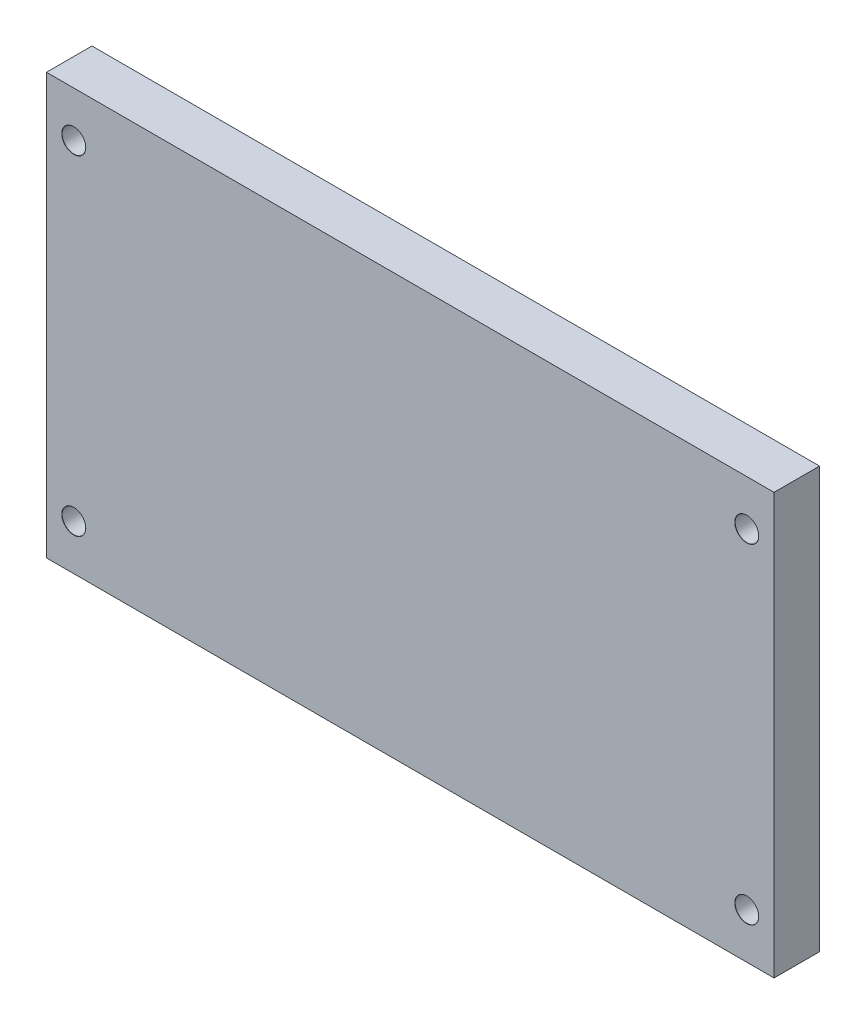
ISO-10303-21;
HEADER;
FILE_DESCRIPTION(('STEP AP214'),'2;1');
FILE_NAME('part.step','',(''),(''),'','','');
FILE_SCHEMA(('AUTOMOTIVE_DESIGN { 1 0 10303 214 1 1 1 1 }'));
ENDSEC;
DATA;
#1=APPLICATION_CONTEXT('core data for automotive mechanical design processes');
#2=APPLICATION_PROTOCOL_DEFINITION('international standard','automotive_design',2000,#1);
#3=PRODUCT_CONTEXT('',#1,'mechanical');
#4=PRODUCT('Part','Part','',(#3));
#5=PRODUCT_RELATED_PRODUCT_CATEGORY('part','',(#4));
#6=PRODUCT_DEFINITION_FORMATION('','',#4);
#7=PRODUCT_DEFINITION_CONTEXT('part definition',#1,'design');
#8=PRODUCT_DEFINITION('design','',#6,#7);
#9=PRODUCT_DEFINITION_SHAPE('','',#8);
#10=(LENGTH_UNIT() NAMED_UNIT(*) SI_UNIT(.MILLI.,.METRE.));
#11=(NAMED_UNIT(*) PLANE_ANGLE_UNIT() SI_UNIT($,.RADIAN.));
#12=(NAMED_UNIT(*) SI_UNIT($,.STERADIAN.) SOLID_ANGLE_UNIT());
#13=UNCERTAINTY_MEASURE_WITH_UNIT(LENGTH_MEASURE(1.E-05),#10,'distance_accuracy_value','');
#14=(GEOMETRIC_REPRESENTATION_CONTEXT(3) GLOBAL_UNCERTAINTY_ASSIGNED_CONTEXT((#13)) GLOBAL_UNIT_ASSIGNED_CONTEXT((#10,
#11,#12)) REPRESENTATION_CONTEXT('',''));
#15=CARTESIAN_POINT('',(0.,0.,0.));
#16=DIRECTION('',(0.,0.,1.));
#17=DIRECTION('',(1.,0.,0.));
#18=AXIS2_PLACEMENT_3D('',#15,#16,#17);
#19=CARTESIAN_POINT('',(50.8,0.,6.35));
#20=DIRECTION('',(1.,0.,0.));
#21=DIRECTION('',(0.,0.,-1.));
#22=AXIS2_PLACEMENT_3D('',#19,#20,#21);
#23=PLANE('',#22);
#24=DIRECTION('',(0.,-1.,0.));
#25=VECTOR('',#24,1.);
#26=CARTESIAN_POINT('',(50.8,0.,0.));
#27=LINE('',#26,#25);
#28=CARTESIAN_POINT('',(50.8,29.36875,0.));
#29=VERTEX_POINT('',#28);
#30=CARTESIAN_POINT('',(50.8,-29.36875,0.));
#31=VERTEX_POINT('',#30);
#32=EDGE_CURVE('E105',#29,#31,#27,.T.);
#33=ORIENTED_EDGE('',*,*,#32,.F.);
#34=DIRECTION('',(0.,0.,-1.));
#35=VECTOR('',#34,1.);
#36=CARTESIAN_POINT('',(50.8,29.36875,6.35));
#37=LINE('',#36,#35);
#38=CARTESIAN_POINT('',(50.8,29.36875,6.35));
#39=VERTEX_POINT('',#38);
#40=EDGE_CURVE('E11',#39,#29,#37,.T.);
#41=ORIENTED_EDGE('',*,*,#40,.F.);
#42=DIRECTION('',(0.,-1.,0.));
#43=VECTOR('',#42,1.);
#44=CARTESIAN_POINT('',(50.8,0.,6.35));
#45=LINE('',#44,#43);
#46=CARTESIAN_POINT('',(50.8,-29.36875,6.35));
#47=VERTEX_POINT('',#46);
#48=EDGE_CURVE('E98',#39,#47,#45,.T.);
#49=ORIENTED_EDGE('',*,*,#48,.T.);
#50=DIRECTION('',(0.,0.,-1.));
#51=VECTOR('',#50,1.);
#52=CARTESIAN_POINT('',(50.8,-29.36875,6.35));
#53=LINE('',#52,#51);
#54=EDGE_CURVE('E79',#47,#31,#53,.T.);
#55=ORIENTED_EDGE('',*,*,#54,.T.);
#56=EDGE_LOOP('',(#33,#41,#49,#55));
#57=FACE_BOUND('',#56,.T.);
#58=ADVANCED_FACE('F41',(#57),#23,.T.);
#59=CARTESIAN_POINT('',(0.,29.36875,6.35));
#60=DIRECTION('',(0.,1.,0.));
#61=DIRECTION('',(-1.,0.,0.));
#62=AXIS2_PLACEMENT_3D('',#59,#60,#61);
#63=PLANE('',#62);
#64=DIRECTION('',(1.,0.,0.));
#65=VECTOR('',#64,1.);
#66=CARTESIAN_POINT('',(0.,29.36875,0.));
#67=LINE('',#66,#65);
#68=CARTESIAN_POINT('',(-50.8,29.36875,0.));
#69=VERTEX_POINT('',#68);
#70=EDGE_CURVE('E92',#69,#29,#67,.T.);
#71=ORIENTED_EDGE('',*,*,#70,.F.);
#72=DIRECTION('',(0.,0.,-1.));
#73=VECTOR('',#72,1.);
#74=CARTESIAN_POINT('',(-50.8,29.36875,6.35));
#75=LINE('',#74,#73);
#76=CARTESIAN_POINT('',(-50.8,29.36875,6.35));
#77=VERTEX_POINT('',#76);
#78=EDGE_CURVE('E49',#77,#69,#75,.T.);
#79=ORIENTED_EDGE('',*,*,#78,.F.);
#80=DIRECTION('',(1.,0.,0.));
#81=VECTOR('',#80,1.);
#82=CARTESIAN_POINT('',(0.,29.36875,6.35));
#83=LINE('',#82,#81);
#84=EDGE_CURVE('E90',#77,#39,#83,.T.);
#85=ORIENTED_EDGE('',*,*,#84,.T.);
#86=ORIENTED_EDGE('',*,*,#40,.T.);
#87=EDGE_LOOP('',(#71,#79,#85,#86));
#88=FACE_BOUND('',#87,.T.);
#89=ADVANCED_FACE('F88',(#88),#63,.T.);
#90=CARTESIAN_POINT('',(-50.8,0.,6.35));
#91=DIRECTION('',(1.,0.,0.));
#92=DIRECTION('',(0.,0.,-1.));
#93=AXIS2_PLACEMENT_3D('',#90,#91,#92);
#94=PLANE('',#93);
#95=DIRECTION('',(0.,-1.,0.));
#96=VECTOR('',#95,1.);
#97=CARTESIAN_POINT('',(-50.8,0.,0.));
#98=LINE('',#97,#96);
#99=CARTESIAN_POINT('',(-50.8,-29.36875,0.));
#100=VERTEX_POINT('',#99);
#101=EDGE_CURVE('E72',#69,#100,#98,.T.);
#102=ORIENTED_EDGE('',*,*,#101,.T.);
#103=DIRECTION('',(0.,0.,-1.));
#104=VECTOR('',#103,1.);
#105=CARTESIAN_POINT('',(-50.8,-29.36875,6.35));
#106=LINE('',#105,#104);
#107=CARTESIAN_POINT('',(-50.8,-29.36875,6.35));
#108=VERTEX_POINT('',#107);
#109=EDGE_CURVE('E93',#108,#100,#106,.T.);
#110=ORIENTED_EDGE('',*,*,#109,.F.);
#111=DIRECTION('',(0.,-1.,0.));
#112=VECTOR('',#111,1.);
#113=CARTESIAN_POINT('',(-50.8,0.,6.35));
#114=LINE('',#113,#112);
#115=EDGE_CURVE('E94',#77,#108,#114,.T.);
#116=ORIENTED_EDGE('',*,*,#115,.F.);
#117=ORIENTED_EDGE('',*,*,#78,.T.);
#118=EDGE_LOOP('',(#102,#110,#116,#117));
#119=FACE_BOUND('',#118,.T.);
#120=ADVANCED_FACE('F95',(#119),#94,.F.);
#121=CARTESIAN_POINT('',(0.,-29.36875,6.35));
#122=DIRECTION('',(0.,1.,0.));
#123=DIRECTION('',(-1.,0.,0.));
#124=AXIS2_PLACEMENT_3D('',#121,#122,#123);
#125=PLANE('',#124);
#126=DIRECTION('',(1.,0.,0.));
#127=VECTOR('',#126,1.);
#128=CARTESIAN_POINT('',(0.,-29.36875,0.));
#129=LINE('',#128,#127);
#130=EDGE_CURVE('E100',#100,#31,#129,.T.);
#131=ORIENTED_EDGE('',*,*,#130,.T.);
#132=ORIENTED_EDGE('',*,*,#54,.F.);
#133=DIRECTION('',(1.,0.,0.));
#134=VECTOR('',#133,1.);
#135=CARTESIAN_POINT('',(0.,-29.36875,6.35));
#136=LINE('',#135,#134);
#137=EDGE_CURVE('E57',#108,#47,#136,.T.);
#138=ORIENTED_EDGE('',*,*,#137,.F.);
#139=ORIENTED_EDGE('',*,*,#109,.T.);
#140=EDGE_LOOP('',(#131,#132,#138,#139));
#141=FACE_BOUND('',#140,.T.);
#142=ADVANCED_FACE('F115',(#141),#125,.F.);
#143=CARTESIAN_POINT('',(0.,0.,6.35));
#144=DIRECTION('',(0.,0.,1.));
#145=DIRECTION('',(1.,0.,0.));
#146=AXIS2_PLACEMENT_3D('',#143,#144,#145);
#147=PLANE('',#146);
#148=CARTESIAN_POINT('',(-46.99,23.01875,6.35));
#149=DIRECTION('',(0.,0.,1.));
#150=DIRECTION('',(1.,0.,0.));
#151=AXIS2_PLACEMENT_3D('',#148,#149,#150);
#152=CIRCLE('',#151,1.675);
#153=CARTESIAN_POINT('',(-45.315,23.01875,6.35));
#154=VERTEX_POINT('',#153);
#155=EDGE_CURVE('E174',#154,#154,#152,.T.);
#156=ORIENTED_EDGE('',*,*,#155,.F.);
#157=EDGE_LOOP('',(#156));
#158=FACE_BOUND('',#157,.T.);
#159=CARTESIAN_POINT('',(-46.99,-23.01875,6.35));
#160=DIRECTION('',(0.,0.,1.));
#161=DIRECTION('',(1.,0.,0.));
#162=AXIS2_PLACEMENT_3D('',#159,#160,#161);
#163=CIRCLE('',#162,1.675);
#164=CARTESIAN_POINT('',(-45.315,-23.01875,6.35));
#165=VERTEX_POINT('',#164);
#166=EDGE_CURVE('E181',#165,#165,#163,.T.);
#167=ORIENTED_EDGE('',*,*,#166,.F.);
#168=EDGE_LOOP('',(#167));
#169=FACE_BOUND('',#168,.T.);
#170=CARTESIAN_POINT('',(46.99,-23.01875,6.35));
#171=DIRECTION('',(0.,0.,1.));
#172=DIRECTION('',(1.,0.,0.));
#173=AXIS2_PLACEMENT_3D('',#170,#171,#172);
#174=CIRCLE('',#173,1.675);
#175=CARTESIAN_POINT('',(48.665,-23.01875,6.35));
#176=VERTEX_POINT('',#175);
#177=EDGE_CURVE('E190',#176,#176,#174,.T.);
#178=ORIENTED_EDGE('',*,*,#177,.F.);
#179=EDGE_LOOP('',(#178));
#180=FACE_BOUND('',#179,.T.);
#181=CARTESIAN_POINT('',(46.99,23.01875,6.35));
#182=DIRECTION('',(0.,0.,1.));
#183=DIRECTION('',(1.,0.,0.));
#184=AXIS2_PLACEMENT_3D('',#181,#182,#183);
#185=CIRCLE('',#184,1.675);
#186=CARTESIAN_POINT('',(48.665,23.01875,6.35));
#187=VERTEX_POINT('',#186);
#188=EDGE_CURVE('E199',#187,#187,#185,.T.);
#189=ORIENTED_EDGE('',*,*,#188,.F.);
#190=EDGE_LOOP('',(#189));
#191=FACE_BOUND('',#190,.T.);
#192=ORIENTED_EDGE('',*,*,#48,.F.);
#193=ORIENTED_EDGE('',*,*,#84,.F.);
#194=ORIENTED_EDGE('',*,*,#115,.T.);
#195=ORIENTED_EDGE('',*,*,#137,.T.);
#196=EDGE_LOOP('',(#192,#193,#194,#195));
#197=FACE_BOUND('',#196,.T.);
#198=ADVANCED_FACE('F97',(#158,#169,#180,#191,#197),#147,.T.);
#199=CARTESIAN_POINT('',(0.,0.,0.));
#200=DIRECTION('',(0.,0.,1.));
#201=DIRECTION('',(1.,0.,0.));
#202=AXIS2_PLACEMENT_3D('',#199,#200,#201);
#203=PLANE('',#202);
#204=CARTESIAN_POINT('',(-46.99,23.01875,0.));
#205=DIRECTION('',(0.,0.,1.));
#206=DIRECTION('',(1.,0.,0.));
#207=AXIS2_PLACEMENT_3D('',#204,#205,#206);
#208=CIRCLE('',#207,1.64999999999999);
#209=CARTESIAN_POINT('',(-45.34,23.01875,0.));
#210=VERTEX_POINT('',#209);
#211=EDGE_CURVE('E176',#210,#210,#208,.T.);
#212=ORIENTED_EDGE('',*,*,#211,.T.);
#213=EDGE_LOOP('',(#212));
#214=FACE_BOUND('',#213,.T.);
#215=CARTESIAN_POINT('',(-46.99,-23.01875,0.));
#216=DIRECTION('',(0.,0.,1.));
#217=DIRECTION('',(1.,0.,0.));
#218=AXIS2_PLACEMENT_3D('',#215,#216,#217);
#219=CIRCLE('',#218,1.64999999999999);
#220=CARTESIAN_POINT('',(-45.34,-23.01875,0.));
#221=VERTEX_POINT('',#220);
#222=EDGE_CURVE('E187',#221,#221,#219,.T.);
#223=ORIENTED_EDGE('',*,*,#222,.T.);
#224=EDGE_LOOP('',(#223));
#225=FACE_BOUND('',#224,.T.);
#226=CARTESIAN_POINT('',(46.99,-23.01875,0.));
#227=DIRECTION('',(0.,0.,1.));
#228=DIRECTION('',(1.,0.,0.));
#229=AXIS2_PLACEMENT_3D('',#226,#227,#228);
#230=CIRCLE('',#229,1.64999999999999);
#231=CARTESIAN_POINT('',(48.64,-23.01875,0.));
#232=VERTEX_POINT('',#231);
#233=EDGE_CURVE('E196',#232,#232,#230,.T.);
#234=ORIENTED_EDGE('',*,*,#233,.T.);
#235=EDGE_LOOP('',(#234));
#236=FACE_BOUND('',#235,.T.);
#237=CARTESIAN_POINT('',(46.99,23.01875,0.));
#238=DIRECTION('',(0.,0.,1.));
#239=DIRECTION('',(1.,0.,0.));
#240=AXIS2_PLACEMENT_3D('',#237,#238,#239);
#241=CIRCLE('',#240,1.64999999999999);
#242=CARTESIAN_POINT('',(48.64,23.01875,0.));
#243=VERTEX_POINT('',#242);
#244=EDGE_CURVE('E108',#243,#243,#241,.T.);
#245=ORIENTED_EDGE('',*,*,#244,.T.);
#246=EDGE_LOOP('',(#245));
#247=FACE_BOUND('',#246,.T.);
#248=ORIENTED_EDGE('',*,*,#32,.T.);
#249=ORIENTED_EDGE('',*,*,#130,.F.);
#250=ORIENTED_EDGE('',*,*,#101,.F.);
#251=ORIENTED_EDGE('',*,*,#70,.T.);
#252=EDGE_LOOP('',(#248,#249,#250,#251));
#253=FACE_BOUND('',#252,.T.);
#254=ADVANCED_FACE('F117',(#214,#225,#236,#247,#253),#203,.F.);
#255=CARTESIAN_POINT('',(46.99,23.01875,6.35));
#256=DIRECTION('',(0.,0.,1.));
#257=DIRECTION('',(1.,0.,0.));
#258=AXIS2_PLACEMENT_3D('',#255,#256,#257);
#259=CYLINDRICAL_SURFACE('',#258,1.64999999999999);
#260=ORIENTED_EDGE('',*,*,#244,.F.);
#261=EDGE_LOOP('',(#260));
#262=FACE_BOUND('',#261,.T.);
#263=CARTESIAN_POINT('',(46.99,23.01875,6.32499999999999));
#264=DIRECTION('',(0.,0.,1.));
#265=DIRECTION('',(1.,0.,0.));
#266=AXIS2_PLACEMENT_3D('',#263,#264,#265);
#267=CIRCLE('',#266,1.64999999999999);
#268=CARTESIAN_POINT('',(48.64,23.01875,6.32499999999999));
#269=VERTEX_POINT('',#268);
#270=EDGE_CURVE('E202',#269,#269,#267,.T.);
#271=ORIENTED_EDGE('',*,*,#270,.T.);
#272=EDGE_LOOP('',(#271));
#273=FACE_BOUND('',#272,.T.);
#274=ADVANCED_FACE('F131',(#262,#273),#259,.F.);
#275=CARTESIAN_POINT('',(46.99,23.01875,6.35));
#276=DIRECTION('',(0.,0.,1.));
#277=DIRECTION('',(1.,0.,0.));
#278=AXIS2_PLACEMENT_3D('',#275,#276,#277);
#279=CONICAL_SURFACE('',#278,1.675,0.785398163397414);
#280=ORIENTED_EDGE('',*,*,#270,.F.);
#281=EDGE_LOOP('',(#280));
#282=FACE_BOUND('',#281,.T.);
#283=ORIENTED_EDGE('',*,*,#188,.T.);
#284=EDGE_LOOP('',(#283));
#285=FACE_BOUND('',#284,.T.);
#286=ADVANCED_FACE('F138',(#282,#285),#279,.F.);
#287=CARTESIAN_POINT('',(46.99,-23.01875,6.35));
#288=DIRECTION('',(0.,0.,1.));
#289=DIRECTION('',(1.,0.,0.));
#290=AXIS2_PLACEMENT_3D('',#287,#288,#289);
#291=CYLINDRICAL_SURFACE('',#290,1.64999999999999);
#292=ORIENTED_EDGE('',*,*,#233,.F.);
#293=EDGE_LOOP('',(#292));
#294=FACE_BOUND('',#293,.T.);
#295=CARTESIAN_POINT('',(46.99,-23.01875,6.32499999999999));
#296=DIRECTION('',(0.,0.,1.));
#297=DIRECTION('',(1.,0.,0.));
#298=AXIS2_PLACEMENT_3D('',#295,#296,#297);
#299=CIRCLE('',#298,1.64999999999999);
#300=CARTESIAN_POINT('',(48.64,-23.01875,6.32499999999999));
#301=VERTEX_POINT('',#300);
#302=EDGE_CURVE('E193',#301,#301,#299,.T.);
#303=ORIENTED_EDGE('',*,*,#302,.T.);
#304=EDGE_LOOP('',(#303));
#305=FACE_BOUND('',#304,.T.);
#306=ADVANCED_FACE('F142',(#294,#305),#291,.F.);
#307=CARTESIAN_POINT('',(46.99,-23.01875,6.35));
#308=DIRECTION('',(0.,0.,1.));
#309=DIRECTION('',(1.,0.,0.));
#310=AXIS2_PLACEMENT_3D('',#307,#308,#309);
#311=CONICAL_SURFACE('',#310,1.675,0.785398163397414);
#312=ORIENTED_EDGE('',*,*,#302,.F.);
#313=EDGE_LOOP('',(#312));
#314=FACE_BOUND('',#313,.T.);
#315=ORIENTED_EDGE('',*,*,#177,.T.);
#316=EDGE_LOOP('',(#315));
#317=FACE_BOUND('',#316,.T.);
#318=ADVANCED_FACE('F146',(#314,#317),#311,.F.);
#319=CARTESIAN_POINT('',(-46.99,-23.01875,6.35));
#320=DIRECTION('',(0.,0.,1.));
#321=DIRECTION('',(1.,0.,0.));
#322=AXIS2_PLACEMENT_3D('',#319,#320,#321);
#323=CYLINDRICAL_SURFACE('',#322,1.64999999999999);
#324=ORIENTED_EDGE('',*,*,#222,.F.);
#325=EDGE_LOOP('',(#324));
#326=FACE_BOUND('',#325,.T.);
#327=CARTESIAN_POINT('',(-46.99,-23.01875,6.32499999999999));
#328=DIRECTION('',(0.,0.,1.));
#329=DIRECTION('',(1.,0.,0.));
#330=AXIS2_PLACEMENT_3D('',#327,#328,#329);
#331=CIRCLE('',#330,1.64999999999999);
#332=CARTESIAN_POINT('',(-45.34,-23.01875,6.32499999999999));
#333=VERTEX_POINT('',#332);
#334=EDGE_CURVE('E184',#333,#333,#331,.T.);
#335=ORIENTED_EDGE('',*,*,#334,.T.);
#336=EDGE_LOOP('',(#335));
#337=FACE_BOUND('',#336,.T.);
#338=ADVANCED_FACE('F150',(#326,#337),#323,.F.);
#339=CARTESIAN_POINT('',(-46.99,-23.01875,6.35));
#340=DIRECTION('',(0.,0.,1.));
#341=DIRECTION('',(1.,0.,0.));
#342=AXIS2_PLACEMENT_3D('',#339,#340,#341);
#343=CONICAL_SURFACE('',#342,1.675,0.785398163397414);
#344=ORIENTED_EDGE('',*,*,#334,.F.);
#345=EDGE_LOOP('',(#344));
#346=FACE_BOUND('',#345,.T.);
#347=ORIENTED_EDGE('',*,*,#166,.T.);
#348=EDGE_LOOP('',(#347));
#349=FACE_BOUND('',#348,.T.);
#350=ADVANCED_FACE('F154',(#346,#349),#343,.F.);
#351=CARTESIAN_POINT('',(-46.99,23.01875,6.35));
#352=DIRECTION('',(0.,0.,1.));
#353=DIRECTION('',(1.,0.,0.));
#354=AXIS2_PLACEMENT_3D('',#351,#352,#353);
#355=CYLINDRICAL_SURFACE('',#354,1.64999999999999);
#356=ORIENTED_EDGE('',*,*,#211,.F.);
#357=EDGE_LOOP('',(#356));
#358=FACE_BOUND('',#357,.T.);
#359=CARTESIAN_POINT('',(-46.99,23.01875,6.32499999999999));
#360=DIRECTION('',(0.,0.,1.));
#361=DIRECTION('',(1.,0.,0.));
#362=AXIS2_PLACEMENT_3D('',#359,#360,#361);
#363=CIRCLE('',#362,1.64999999999999);
#364=CARTESIAN_POINT('',(-45.34,23.01875,6.32499999999999));
#365=VERTEX_POINT('',#364);
#366=EDGE_CURVE('E171',#365,#365,#363,.T.);
#367=ORIENTED_EDGE('',*,*,#366,.T.);
#368=EDGE_LOOP('',(#367));
#369=FACE_BOUND('',#368,.T.);
#370=ADVANCED_FACE('F158',(#358,#369),#355,.F.);
#371=CARTESIAN_POINT('',(-46.99,23.01875,6.35));
#372=DIRECTION('',(0.,0.,1.));
#373=DIRECTION('',(1.,0.,0.));
#374=AXIS2_PLACEMENT_3D('',#371,#372,#373);
#375=CONICAL_SURFACE('',#374,1.675,0.785398163397414);
#376=ORIENTED_EDGE('',*,*,#366,.F.);
#377=EDGE_LOOP('',(#376));
#378=FACE_BOUND('',#377,.T.);
#379=ORIENTED_EDGE('',*,*,#155,.T.);
#380=EDGE_LOOP('',(#379));
#381=FACE_BOUND('',#380,.T.);
#382=ADVANCED_FACE('F162',(#378,#381),#375,.F.);
#383=CLOSED_SHELL('',(#58,#89,#120,#142,#198,#254,#274,#286,#306,#318,#338,#350,#370,#382));
#384=MANIFOLD_SOLID_BREP('B2',#383);
#385=ADVANCED_BREP_SHAPE_REPRESENTATION('',(#18,#384),#14);
#386=SHAPE_DEFINITION_REPRESENTATION(#9,#385);
ENDSEC;
END-ISO-10303-21;
